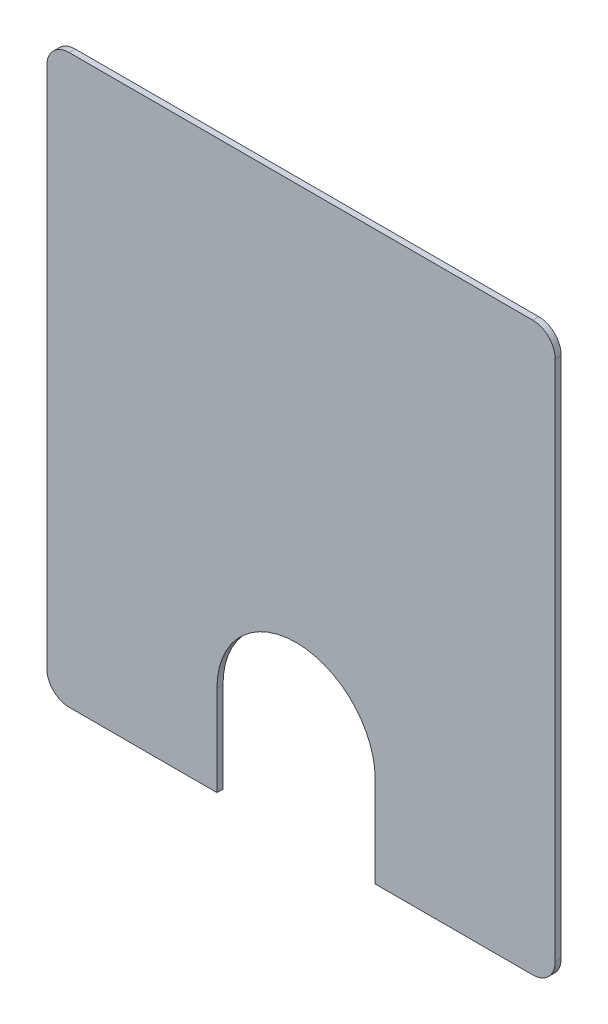
ISO-10303-21;
HEADER;
FILE_DESCRIPTION(('STEP AP214'),'2;1');
FILE_NAME('part.step','',(''),(''),'','','');
FILE_SCHEMA(('AUTOMOTIVE_DESIGN { 1 0 10303 214 1 1 1 1 }'));
ENDSEC;
DATA;
#1=APPLICATION_CONTEXT('core data for automotive mechanical design processes');
#2=APPLICATION_PROTOCOL_DEFINITION('international standard','automotive_design',2000,#1);
#3=PRODUCT_CONTEXT('',#1,'mechanical');
#4=PRODUCT('Part','Part','',(#3));
#5=PRODUCT_RELATED_PRODUCT_CATEGORY('part','',(#4));
#6=PRODUCT_DEFINITION_FORMATION('','',#4);
#7=PRODUCT_DEFINITION_CONTEXT('part definition',#1,'design');
#8=PRODUCT_DEFINITION('design','',#6,#7);
#9=PRODUCT_DEFINITION_SHAPE('','',#8);
#10=(LENGTH_UNIT() NAMED_UNIT(*) SI_UNIT(.MILLI.,.METRE.));
#11=(NAMED_UNIT(*) PLANE_ANGLE_UNIT() SI_UNIT($,.RADIAN.));
#12=(NAMED_UNIT(*) SI_UNIT($,.STERADIAN.) SOLID_ANGLE_UNIT());
#13=UNCERTAINTY_MEASURE_WITH_UNIT(LENGTH_MEASURE(1.E-05),#10,'distance_accuracy_value','');
#14=(GEOMETRIC_REPRESENTATION_CONTEXT(3) GLOBAL_UNCERTAINTY_ASSIGNED_CONTEXT((#13)) GLOBAL_UNIT_ASSIGNED_CONTEXT((#10,
#11,#12)) REPRESENTATION_CONTEXT('',''));
#15=CARTESIAN_POINT('',(0.,0.,0.));
#16=DIRECTION('',(0.,0.,1.));
#17=DIRECTION('',(1.,0.,0.));
#18=AXIS2_PLACEMENT_3D('',#15,#16,#17);
#19=CARTESIAN_POINT('',(-103.5,-116.6,2.7));
#20=DIRECTION('',(0.,0.,-1.));
#21=DIRECTION('',(-1.,0.,0.));
#22=AXIS2_PLACEMENT_3D('',#19,#20,#21);
#23=CYLINDRICAL_SURFACE('',#22,9.99999999999999);
#24=CARTESIAN_POINT('',(-103.5,-116.6,0.));
#25=DIRECTION('',(0.,0.,1.));
#26=DIRECTION('',(1.,0.,0.));
#27=AXIS2_PLACEMENT_3D('',#24,#25,#26);
#28=CIRCLE('',#27,9.99999999999999);
#29=CARTESIAN_POINT('',(-113.5,-116.6,0.));
#30=VERTEX_POINT('',#29);
#31=CARTESIAN_POINT('',(-103.5,-126.6,0.));
#32=VERTEX_POINT('',#31);
#33=EDGE_CURVE('E158',#30,#32,#28,.T.);
#34=ORIENTED_EDGE('',*,*,#33,.T.);
#35=DIRECTION('',(0.,0.,-1.));
#36=VECTOR('',#35,1.);
#37=CARTESIAN_POINT('',(-103.5,-126.6,2.7));
#38=LINE('',#37,#36);
#39=CARTESIAN_POINT('',(-103.5,-126.6,2.7));
#40=VERTEX_POINT('',#39);
#41=EDGE_CURVE('E11',#40,#32,#38,.T.);
#42=ORIENTED_EDGE('',*,*,#41,.F.);
#43=CARTESIAN_POINT('',(-103.5,-116.6,2.7));
#44=DIRECTION('',(0.,0.,1.));
#45=DIRECTION('',(1.,0.,0.));
#46=AXIS2_PLACEMENT_3D('',#43,#44,#45);
#47=CIRCLE('',#46,9.99999999999999);
#48=CARTESIAN_POINT('',(-113.5,-116.6,2.7));
#49=VERTEX_POINT('',#48);
#50=EDGE_CURVE('E180',#49,#40,#47,.T.);
#51=ORIENTED_EDGE('',*,*,#50,.F.);
#52=DIRECTION('',(0.,0.,-1.));
#53=VECTOR('',#52,1.);
#54=CARTESIAN_POINT('',(-113.5,-116.6,2.7));
#55=LINE('',#54,#53);
#56=EDGE_CURVE('E154',#49,#30,#55,.T.);
#57=ORIENTED_EDGE('',*,*,#56,.T.);
#58=EDGE_LOOP('',(#34,#42,#51,#57));
#59=FACE_BOUND('',#58,.T.);
#60=ADVANCED_FACE('F38',(#59),#23,.T.);
#61=CARTESIAN_POINT('',(-103.5,-126.6,2.7));
#62=DIRECTION('',(0.,1.,0.));
#63=DIRECTION('',(0.,0.,1.));
#64=AXIS2_PLACEMENT_3D('',#61,#62,#63);
#65=PLANE('',#64);
#66=DIRECTION('',(1.,0.,0.));
#67=VECTOR('',#66,1.);
#68=CARTESIAN_POINT('',(-103.5,-126.6,0.));
#69=LINE('',#68,#67);
#70=CARTESIAN_POINT('',(-37.5249457854346,-126.6,0.));
#71=VERTEX_POINT('',#70);
#72=EDGE_CURVE('E161',#32,#71,#69,.T.);
#73=ORIENTED_EDGE('',*,*,#72,.T.);
#74=DIRECTION('',(0.,0.,-1.));
#75=VECTOR('',#74,1.);
#76=CARTESIAN_POINT('',(-37.5249457854346,-126.6,2.7));
#77=LINE('',#76,#75);
#78=CARTESIAN_POINT('',(-37.5249457854346,-126.6,2.7));
#79=VERTEX_POINT('',#78);
#80=EDGE_CURVE('E46',#79,#71,#77,.T.);
#81=ORIENTED_EDGE('',*,*,#80,.F.);
#82=DIRECTION('',(1.,0.,0.));
#83=VECTOR('',#82,1.);
#84=CARTESIAN_POINT('',(-103.5,-126.6,2.7));
#85=LINE('',#84,#83);
#86=EDGE_CURVE('E109',#40,#79,#85,.T.);
#87=ORIENTED_EDGE('',*,*,#86,.F.);
#88=ORIENTED_EDGE('',*,*,#41,.T.);
#89=EDGE_LOOP('',(#73,#81,#87,#88));
#90=FACE_BOUND('',#89,.T.);
#91=ADVANCED_FACE('F258',(#90),#65,.F.);
#92=CARTESIAN_POINT('',(-37.5249457854346,-86.2035481920579,2.7));
#93=DIRECTION('',(-1.,0.,0.));
#94=DIRECTION('',(0.,-1.,0.));
#95=AXIS2_PLACEMENT_3D('',#92,#93,#94);
#96=PLANE('',#95);
#97=DIRECTION('',(0.,1.,0.));
#98=VECTOR('',#97,1.);
#99=CARTESIAN_POINT('',(-37.5249457854346,-86.2035481920579,0.));
#100=LINE('',#99,#98);
#101=CARTESIAN_POINT('',(-37.5249457854346,-86.2035481920579,0.));
#102=VERTEX_POINT('',#101);
#103=EDGE_CURVE('E163',#71,#102,#100,.T.);
#104=ORIENTED_EDGE('',*,*,#103,.T.);
#105=DIRECTION('',(0.,0.,-1.));
#106=VECTOR('',#105,1.);
#107=CARTESIAN_POINT('',(-37.5249457854346,-86.2035481920579,2.7));
#108=LINE('',#107,#106);
#109=CARTESIAN_POINT('',(-37.5249457854346,-86.2035481920579,2.7));
#110=VERTEX_POINT('',#109);
#111=EDGE_CURVE('E199',#110,#102,#108,.T.);
#112=ORIENTED_EDGE('',*,*,#111,.F.);
#113=DIRECTION('',(0.,1.,0.));
#114=VECTOR('',#113,1.);
#115=CARTESIAN_POINT('',(-37.5249457854346,-86.2035481920579,2.7));
#116=LINE('',#115,#114);
#117=EDGE_CURVE('E207',#79,#110,#116,.T.);
#118=ORIENTED_EDGE('',*,*,#117,.F.);
#119=ORIENTED_EDGE('',*,*,#80,.T.);
#120=EDGE_LOOP('',(#104,#112,#118,#119));
#121=FACE_BOUND('',#120,.T.);
#122=ADVANCED_FACE('F205',(#121),#96,.F.);
#123=CARTESIAN_POINT('',(-2.18750000003506,-86.2035481920579,2.7));
#124=DIRECTION('',(0.,0.,-1.));
#125=DIRECTION('',(-1.,0.,0.));
#126=AXIS2_PLACEMENT_3D('',#123,#124,#125);
#127=CYLINDRICAL_SURFACE('',#126,35.3374457853996);
#128=CARTESIAN_POINT('',(-2.18750000003506,-86.2035481920579,0.));
#129=DIRECTION('',(0.,0.,-1.));
#130=DIRECTION('',(1.,0.,0.));
#131=AXIS2_PLACEMENT_3D('',#128,#129,#130);
#132=CIRCLE('',#131,35.3374457853996);
#133=CARTESIAN_POINT('',(33.1499457853645,-86.2035481920579,0.));
#134=VERTEX_POINT('',#133);
#135=EDGE_CURVE('E165',#102,#134,#132,.T.);
#136=ORIENTED_EDGE('',*,*,#135,.T.);
#137=DIRECTION('',(0.,0.,-1.));
#138=VECTOR('',#137,1.);
#139=CARTESIAN_POINT('',(33.1499457853645,-86.2035481920579,2.7));
#140=LINE('',#139,#138);
#141=CARTESIAN_POINT('',(33.1499457853645,-86.2035481920579,2.7));
#142=VERTEX_POINT('',#141);
#143=EDGE_CURVE('E196',#142,#134,#140,.T.);
#144=ORIENTED_EDGE('',*,*,#143,.F.);
#145=CARTESIAN_POINT('',(-2.18750000003506,-86.2035481920579,2.7));
#146=DIRECTION('',(0.,0.,-1.));
#147=DIRECTION('',(1.,0.,0.));
#148=AXIS2_PLACEMENT_3D('',#145,#146,#147);
#149=CIRCLE('',#148,35.3374457853996);
#150=EDGE_CURVE('E225',#110,#142,#149,.T.);
#151=ORIENTED_EDGE('',*,*,#150,.F.);
#152=ORIENTED_EDGE('',*,*,#111,.T.);
#153=EDGE_LOOP('',(#136,#144,#151,#152));
#154=FACE_BOUND('',#153,.T.);
#155=ADVANCED_FACE('F216',(#154),#127,.F.);
#156=CARTESIAN_POINT('',(33.1499457853645,-86.2035481920579,2.7));
#157=DIRECTION('',(1.,0.,0.));
#158=DIRECTION('',(0.,1.,0.));
#159=AXIS2_PLACEMENT_3D('',#156,#157,#158);
#160=PLANE('',#159);
#161=DIRECTION('',(0.,-1.,0.));
#162=VECTOR('',#161,1.);
#163=CARTESIAN_POINT('',(33.1499457853645,-86.2035481920579,0.));
#164=LINE('',#163,#162);
#165=CARTESIAN_POINT('',(33.1499457853645,-126.6,0.));
#166=VERTEX_POINT('',#165);
#167=EDGE_CURVE('E167',#134,#166,#164,.T.);
#168=ORIENTED_EDGE('',*,*,#167,.T.);
#169=DIRECTION('',(0.,0.,-1.));
#170=VECTOR('',#169,1.);
#171=CARTESIAN_POINT('',(33.1499457853645,-126.6,2.7));
#172=LINE('',#171,#170);
#173=CARTESIAN_POINT('',(33.1499457853645,-126.6,2.7));
#174=VERTEX_POINT('',#173);
#175=EDGE_CURVE('E193',#174,#166,#172,.T.);
#176=ORIENTED_EDGE('',*,*,#175,.F.);
#177=DIRECTION('',(0.,-1.,0.));
#178=VECTOR('',#177,1.);
#179=CARTESIAN_POINT('',(33.1499457853645,-86.2035481920579,2.7));
#180=LINE('',#179,#178);
#181=EDGE_CURVE('E222',#142,#174,#180,.T.);
#182=ORIENTED_EDGE('',*,*,#181,.F.);
#183=ORIENTED_EDGE('',*,*,#143,.T.);
#184=EDGE_LOOP('',(#168,#176,#182,#183));
#185=FACE_BOUND('',#184,.T.);
#186=ADVANCED_FACE('F220',(#185),#160,.F.);
#187=CARTESIAN_POINT('',(33.1499457853645,-126.6,2.7));
#188=DIRECTION('',(0.,1.,0.));
#189=DIRECTION('',(0.,0.,1.));
#190=AXIS2_PLACEMENT_3D('',#187,#188,#189);
#191=PLANE('',#190);
#192=DIRECTION('',(1.,0.,0.));
#193=VECTOR('',#192,1.);
#194=CARTESIAN_POINT('',(33.1499457853645,-126.6,0.));
#195=LINE('',#194,#193);
#196=CARTESIAN_POINT('',(103.5,-126.6,0.));
#197=VERTEX_POINT('',#196);
#198=EDGE_CURVE('E169',#166,#197,#195,.T.);
#199=ORIENTED_EDGE('',*,*,#198,.T.);
#200=DIRECTION('',(0.,0.,-1.));
#201=VECTOR('',#200,1.);
#202=CARTESIAN_POINT('',(103.5,-126.6,2.7));
#203=LINE('',#202,#201);
#204=CARTESIAN_POINT('',(103.5,-126.6,2.7));
#205=VERTEX_POINT('',#204);
#206=EDGE_CURVE('E190',#205,#197,#203,.T.);
#207=ORIENTED_EDGE('',*,*,#206,.F.);
#208=DIRECTION('',(1.,0.,0.));
#209=VECTOR('',#208,1.);
#210=CARTESIAN_POINT('',(33.1499457853645,-126.6,2.7));
#211=LINE('',#210,#209);
#212=EDGE_CURVE('E224',#174,#205,#211,.T.);
#213=ORIENTED_EDGE('',*,*,#212,.F.);
#214=ORIENTED_EDGE('',*,*,#175,.T.);
#215=EDGE_LOOP('',(#199,#207,#213,#214));
#216=FACE_BOUND('',#215,.T.);
#217=ADVANCED_FACE('F271',(#216),#191,.F.);
#218=CARTESIAN_POINT('',(103.5,-116.6,2.7));
#219=DIRECTION('',(0.,0.,-1.));
#220=DIRECTION('',(-1.,0.,0.));
#221=AXIS2_PLACEMENT_3D('',#218,#219,#220);
#222=CYLINDRICAL_SURFACE('',#221,9.99999999999999);
#223=CARTESIAN_POINT('',(103.5,-116.6,0.));
#224=DIRECTION('',(0.,0.,1.));
#225=DIRECTION('',(1.,0.,0.));
#226=AXIS2_PLACEMENT_3D('',#223,#224,#225);
#227=CIRCLE('',#226,9.99999999999999);
#228=CARTESIAN_POINT('',(113.5,-116.6,0.));
#229=VERTEX_POINT('',#228);
#230=EDGE_CURVE('E171',#197,#229,#227,.T.);
#231=ORIENTED_EDGE('',*,*,#230,.T.);
#232=DIRECTION('',(0.,0.,-1.));
#233=VECTOR('',#232,1.);
#234=CARTESIAN_POINT('',(113.5,-116.6,2.7));
#235=LINE('',#234,#233);
#236=CARTESIAN_POINT('',(113.5,-116.6,2.7));
#237=VERTEX_POINT('',#236);
#238=EDGE_CURVE('E187',#237,#229,#235,.T.);
#239=ORIENTED_EDGE('',*,*,#238,.F.);
#240=CARTESIAN_POINT('',(103.5,-116.6,2.7));
#241=DIRECTION('',(0.,0.,1.));
#242=DIRECTION('',(1.,0.,0.));
#243=AXIS2_PLACEMENT_3D('',#240,#241,#242);
#244=CIRCLE('',#243,9.99999999999999);
#245=EDGE_CURVE('E227',#205,#237,#244,.T.);
#246=ORIENTED_EDGE('',*,*,#245,.F.);
#247=ORIENTED_EDGE('',*,*,#206,.T.);
#248=EDGE_LOOP('',(#231,#239,#246,#247));
#249=FACE_BOUND('',#248,.T.);
#250=ADVANCED_FACE('F274',(#249),#222,.T.);
#251=CARTESIAN_POINT('',(113.5,116.6,2.7));
#252=DIRECTION('',(-1.,0.,0.));
#253=DIRECTION('',(0.,0.,1.));
#254=AXIS2_PLACEMENT_3D('',#251,#252,#253);
#255=PLANE('',#254);
#256=DIRECTION('',(0.,1.,0.));
#257=VECTOR('',#256,1.);
#258=CARTESIAN_POINT('',(113.5,116.6,0.));
#259=LINE('',#258,#257);
#260=CARTESIAN_POINT('',(113.5,116.6,0.));
#261=VERTEX_POINT('',#260);
#262=EDGE_CURVE('E173',#229,#261,#259,.T.);
#263=ORIENTED_EDGE('',*,*,#262,.T.);
#264=DIRECTION('',(0.,0.,-1.));
#265=VECTOR('',#264,1.);
#266=CARTESIAN_POINT('',(113.5,116.6,2.7));
#267=LINE('',#266,#265);
#268=CARTESIAN_POINT('',(113.5,116.6,2.7));
#269=VERTEX_POINT('',#268);
#270=EDGE_CURVE('E184',#269,#261,#267,.T.);
#271=ORIENTED_EDGE('',*,*,#270,.F.);
#272=DIRECTION('',(0.,1.,0.));
#273=VECTOR('',#272,1.);
#274=CARTESIAN_POINT('',(113.5,116.6,2.7));
#275=LINE('',#274,#273);
#276=EDGE_CURVE('E233',#237,#269,#275,.T.);
#277=ORIENTED_EDGE('',*,*,#276,.F.);
#278=ORIENTED_EDGE('',*,*,#238,.T.);
#279=EDGE_LOOP('',(#263,#271,#277,#278));
#280=FACE_BOUND('',#279,.T.);
#281=ADVANCED_FACE('F239',(#280),#255,.F.);
#282=CARTESIAN_POINT('',(103.5,116.6,2.7));
#283=DIRECTION('',(0.,0.,-1.));
#284=DIRECTION('',(-1.,0.,0.));
#285=AXIS2_PLACEMENT_3D('',#282,#283,#284);
#286=CYLINDRICAL_SURFACE('',#285,9.99999999999999);
#287=CARTESIAN_POINT('',(103.5,116.6,0.));
#288=DIRECTION('',(0.,0.,1.));
#289=DIRECTION('',(-1.,0.,0.));
#290=AXIS2_PLACEMENT_3D('',#287,#288,#289);
#291=CIRCLE('',#290,9.99999999999999);
#292=CARTESIAN_POINT('',(103.5,126.6,0.));
#293=VERTEX_POINT('',#292);
#294=EDGE_CURVE('E175',#261,#293,#291,.T.);
#295=ORIENTED_EDGE('',*,*,#294,.T.);
#296=DIRECTION('',(0.,0.,-1.));
#297=VECTOR('',#296,1.);
#298=CARTESIAN_POINT('',(103.5,126.6,2.7));
#299=LINE('',#298,#297);
#300=CARTESIAN_POINT('',(103.5,126.6,2.7));
#301=VERTEX_POINT('',#300);
#302=EDGE_CURVE('E149',#301,#293,#299,.T.);
#303=ORIENTED_EDGE('',*,*,#302,.F.);
#304=CARTESIAN_POINT('',(103.5,116.6,2.7));
#305=DIRECTION('',(0.,0.,1.));
#306=DIRECTION('',(-1.,0.,0.));
#307=AXIS2_PLACEMENT_3D('',#304,#305,#306);
#308=CIRCLE('',#307,9.99999999999999);
#309=EDGE_CURVE('E140',#269,#301,#308,.T.);
#310=ORIENTED_EDGE('',*,*,#309,.F.);
#311=ORIENTED_EDGE('',*,*,#270,.T.);
#312=EDGE_LOOP('',(#295,#303,#310,#311));
#313=FACE_BOUND('',#312,.T.);
#314=ADVANCED_FACE('F243',(#313),#286,.T.);
#315=CARTESIAN_POINT('',(-103.5,126.6,2.7));
#316=DIRECTION('',(0.,-1.,0.));
#317=DIRECTION('',(0.,0.,-1.));
#318=AXIS2_PLACEMENT_3D('',#315,#316,#317);
#319=PLANE('',#318);
#320=DIRECTION('',(-1.,0.,0.));
#321=VECTOR('',#320,1.);
#322=CARTESIAN_POINT('',(-103.5,126.6,0.));
#323=LINE('',#322,#321);
#324=CARTESIAN_POINT('',(-103.5,126.6,0.));
#325=VERTEX_POINT('',#324);
#326=EDGE_CURVE('E148',#293,#325,#323,.T.);
#327=ORIENTED_EDGE('',*,*,#326,.T.);
#328=DIRECTION('',(0.,0.,-1.));
#329=VECTOR('',#328,1.);
#330=CARTESIAN_POINT('',(-103.5,126.6,2.7));
#331=LINE('',#330,#329);
#332=CARTESIAN_POINT('',(-103.5,126.6,2.7));
#333=VERTEX_POINT('',#332);
#334=EDGE_CURVE('E145',#333,#325,#331,.T.);
#335=ORIENTED_EDGE('',*,*,#334,.F.);
#336=DIRECTION('',(-1.,0.,0.));
#337=VECTOR('',#336,1.);
#338=CARTESIAN_POINT('',(-103.5,126.6,2.7));
#339=LINE('',#338,#337);
#340=EDGE_CURVE('E134',#301,#333,#339,.T.);
#341=ORIENTED_EDGE('',*,*,#340,.F.);
#342=ORIENTED_EDGE('',*,*,#302,.T.);
#343=EDGE_LOOP('',(#327,#335,#341,#342));
#344=FACE_BOUND('',#343,.T.);
#345=ADVANCED_FACE('F146',(#344),#319,.F.);
#346=CARTESIAN_POINT('',(-103.5,116.6,2.7));
#347=DIRECTION('',(0.,0.,-1.));
#348=DIRECTION('',(-1.,0.,0.));
#349=AXIS2_PLACEMENT_3D('',#346,#347,#348);
#350=CYLINDRICAL_SURFACE('',#349,9.99999999999999);
#351=CARTESIAN_POINT('',(-103.5,116.6,0.));
#352=DIRECTION('',(0.,0.,1.));
#353=DIRECTION('',(1.,0.,0.));
#354=AXIS2_PLACEMENT_3D('',#351,#352,#353);
#355=CIRCLE('',#354,9.99999999999999);
#356=CARTESIAN_POINT('',(-113.5,116.6,0.));
#357=VERTEX_POINT('',#356);
#358=EDGE_CURVE('E95',#325,#357,#355,.T.);
#359=ORIENTED_EDGE('',*,*,#358,.T.);
#360=DIRECTION('',(0.,0.,-1.));
#361=VECTOR('',#360,1.);
#362=CARTESIAN_POINT('',(-113.5,116.6,2.7));
#363=LINE('',#362,#361);
#364=CARTESIAN_POINT('',(-113.5,116.6,2.7));
#365=VERTEX_POINT('',#364);
#366=EDGE_CURVE('E150',#365,#357,#363,.T.);
#367=ORIENTED_EDGE('',*,*,#366,.F.);
#368=CARTESIAN_POINT('',(-103.5,116.6,2.7));
#369=DIRECTION('',(0.,0.,1.));
#370=DIRECTION('',(1.,0.,0.));
#371=AXIS2_PLACEMENT_3D('',#368,#369,#370);
#372=CIRCLE('',#371,9.99999999999999);
#373=EDGE_CURVE('E138',#333,#365,#372,.T.);
#374=ORIENTED_EDGE('',*,*,#373,.F.);
#375=ORIENTED_EDGE('',*,*,#334,.T.);
#376=EDGE_LOOP('',(#359,#367,#374,#375));
#377=FACE_BOUND('',#376,.T.);
#378=ADVANCED_FACE('F152',(#377),#350,.T.);
#379=CARTESIAN_POINT('',(-113.5,116.6,2.7));
#380=DIRECTION('',(1.,0.,0.));
#381=DIRECTION('',(0.,1.,0.));
#382=AXIS2_PLACEMENT_3D('',#379,#380,#381);
#383=PLANE('',#382);
#384=DIRECTION('',(0.,-1.,0.));
#385=VECTOR('',#384,1.);
#386=CARTESIAN_POINT('',(-113.5,116.6,0.));
#387=LINE('',#386,#385);
#388=EDGE_CURVE('E101',#357,#30,#387,.T.);
#389=ORIENTED_EDGE('',*,*,#388,.T.);
#390=ORIENTED_EDGE('',*,*,#56,.F.);
#391=DIRECTION('',(0.,-1.,0.));
#392=VECTOR('',#391,1.);
#393=CARTESIAN_POINT('',(-113.5,116.6,2.7));
#394=LINE('',#393,#392);
#395=EDGE_CURVE('E54',#365,#49,#394,.T.);
#396=ORIENTED_EDGE('',*,*,#395,.F.);
#397=ORIENTED_EDGE('',*,*,#366,.T.);
#398=EDGE_LOOP('',(#389,#390,#396,#397));
#399=FACE_BOUND('',#398,.T.);
#400=ADVANCED_FACE('F247',(#399),#383,.F.);
#401=CARTESIAN_POINT('',(-103.5,-116.6,2.7));
#402=DIRECTION('',(0.,0.,1.));
#403=DIRECTION('',(1.,0.,0.));
#404=AXIS2_PLACEMENT_3D('',#401,#402,#403);
#405=PLANE('',#404);
#406=ORIENTED_EDGE('',*,*,#50,.T.);
#407=ORIENTED_EDGE('',*,*,#86,.T.);
#408=ORIENTED_EDGE('',*,*,#117,.T.);
#409=ORIENTED_EDGE('',*,*,#150,.T.);
#410=ORIENTED_EDGE('',*,*,#181,.T.);
#411=ORIENTED_EDGE('',*,*,#212,.T.);
#412=ORIENTED_EDGE('',*,*,#245,.T.);
#413=ORIENTED_EDGE('',*,*,#276,.T.);
#414=ORIENTED_EDGE('',*,*,#309,.T.);
#415=ORIENTED_EDGE('',*,*,#340,.T.);
#416=ORIENTED_EDGE('',*,*,#373,.T.);
#417=ORIENTED_EDGE('',*,*,#395,.T.);
#418=EDGE_LOOP('',(#406,#407,#408,#409,#410,#411,#412,#413,#414,#415,#416,#417));
#419=FACE_BOUND('',#418,.T.);
#420=ADVANCED_FACE('F136',(#419),#405,.T.);
#421=CARTESIAN_POINT('',(-103.5,-116.6,0.));
#422=DIRECTION('',(0.,0.,1.));
#423=DIRECTION('',(1.,0.,0.));
#424=AXIS2_PLACEMENT_3D('',#421,#422,#423);
#425=PLANE('',#424);
#426=ORIENTED_EDGE('',*,*,#33,.F.);
#427=ORIENTED_EDGE('',*,*,#388,.F.);
#428=ORIENTED_EDGE('',*,*,#358,.F.);
#429=ORIENTED_EDGE('',*,*,#326,.F.);
#430=ORIENTED_EDGE('',*,*,#294,.F.);
#431=ORIENTED_EDGE('',*,*,#262,.F.);
#432=ORIENTED_EDGE('',*,*,#230,.F.);
#433=ORIENTED_EDGE('',*,*,#198,.F.);
#434=ORIENTED_EDGE('',*,*,#167,.F.);
#435=ORIENTED_EDGE('',*,*,#135,.F.);
#436=ORIENTED_EDGE('',*,*,#103,.F.);
#437=ORIENTED_EDGE('',*,*,#72,.F.);
#438=EDGE_LOOP('',(#426,#427,#428,#429,#430,#431,#432,#433,#434,#435,#436,#437));
#439=FACE_BOUND('',#438,.T.);
#440=ADVANCED_FACE('F211',(#439),#425,.F.);
#441=CLOSED_SHELL('',(#60,#91,#122,#155,#186,#217,#250,#281,#314,#345,#378,#400,#420,#440));
#442=MANIFOLD_SOLID_BREP('B2',#441);
#443=ADVANCED_BREP_SHAPE_REPRESENTATION('',(#18,#442),#14);
#444=SHAPE_DEFINITION_REPRESENTATION(#9,#443);
ENDSEC;
END-ISO-10303-21;
